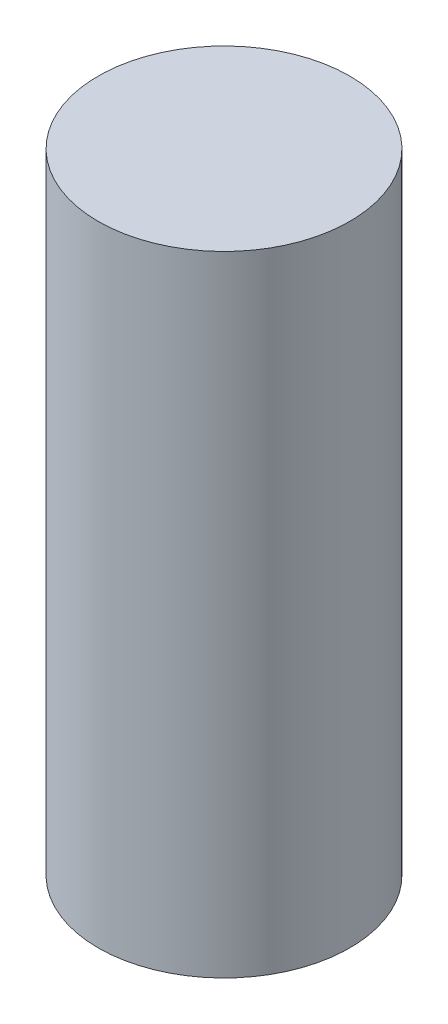
ISO-10303-21;
HEADER;
FILE_DESCRIPTION(('STEP AP214'),'2;1');
FILE_NAME('part.step','',(''),(''),'','','');
FILE_SCHEMA(('AUTOMOTIVE_DESIGN { 1 0 10303 214 1 1 1 1 }'));
ENDSEC;
DATA;
#1=APPLICATION_CONTEXT('core data for automotive mechanical design processes');
#2=APPLICATION_PROTOCOL_DEFINITION('international standard','automotive_design',2000,#1);
#3=PRODUCT_CONTEXT('',#1,'mechanical');
#4=PRODUCT('Part','Part','',(#3));
#5=PRODUCT_RELATED_PRODUCT_CATEGORY('part','',(#4));
#6=PRODUCT_DEFINITION_FORMATION('','',#4);
#7=PRODUCT_DEFINITION_CONTEXT('part definition',#1,'design');
#8=PRODUCT_DEFINITION('design','',#6,#7);
#9=PRODUCT_DEFINITION_SHAPE('','',#8);
#10=(LENGTH_UNIT() NAMED_UNIT(*) SI_UNIT(.MILLI.,.METRE.));
#11=(NAMED_UNIT(*) PLANE_ANGLE_UNIT() SI_UNIT($,.RADIAN.));
#12=(NAMED_UNIT(*) SI_UNIT($,.STERADIAN.) SOLID_ANGLE_UNIT());
#13=UNCERTAINTY_MEASURE_WITH_UNIT(LENGTH_MEASURE(1.E-05),#10,'distance_accuracy_value','');
#14=(GEOMETRIC_REPRESENTATION_CONTEXT(3) GLOBAL_UNCERTAINTY_ASSIGNED_CONTEXT((#13)) GLOBAL_UNIT_ASSIGNED_CONTEXT((#10,
#11,#12)) REPRESENTATION_CONTEXT('',''));
#15=CARTESIAN_POINT('',(0.,0.,0.));
#16=DIRECTION('',(0.,0.,1.));
#17=DIRECTION('',(1.,0.,0.));
#18=AXIS2_PLACEMENT_3D('',#15,#16,#17);
#19=CARTESIAN_POINT('',(0.,100.,0.));
#20=DIRECTION('',(0.,-1.,0.));
#21=DIRECTION('',(0.,0.,-1.));
#22=AXIS2_PLACEMENT_3D('',#19,#20,#21);
#23=CYLINDRICAL_SURFACE('',#22,20.);
#24=CARTESIAN_POINT('',(0.,100.,0.));
#25=DIRECTION('',(0.,1.,0.));
#26=DIRECTION('',(0.,0.,1.));
#27=AXIS2_PLACEMENT_3D('',#24,#25,#26);
#28=CIRCLE('',#27,20.);
#29=CARTESIAN_POINT('',(0.,100.,20.));
#30=VERTEX_POINT('',#29);
#31=EDGE_CURVE('E10',#30,#30,#28,.T.);
#32=ORIENTED_EDGE('',*,*,#31,.F.);
#33=EDGE_LOOP('',(#32));
#34=FACE_BOUND('',#33,.T.);
#35=CARTESIAN_POINT('',(0.,0.,0.));
#36=DIRECTION('',(0.,1.,0.));
#37=DIRECTION('',(0.,0.,1.));
#38=AXIS2_PLACEMENT_3D('',#35,#36,#37);
#39=CIRCLE('',#38,20.);
#40=CARTESIAN_POINT('',(0.,0.,20.));
#41=VERTEX_POINT('',#40);
#42=EDGE_CURVE('E44',#41,#41,#39,.T.);
#43=ORIENTED_EDGE('',*,*,#42,.T.);
#44=EDGE_LOOP('',(#43));
#45=FACE_BOUND('',#44,.T.);
#46=ADVANCED_FACE('F41',(#34,#45),#23,.T.);
#47=CARTESIAN_POINT('',(0.,100.,0.));
#48=DIRECTION('',(0.,1.,0.));
#49=DIRECTION('',(0.,0.,1.));
#50=AXIS2_PLACEMENT_3D('',#47,#48,#49);
#51=PLANE('',#50);
#52=ORIENTED_EDGE('',*,*,#31,.T.);
#53=EDGE_LOOP('',(#52));
#54=FACE_BOUND('',#53,.T.);
#55=ADVANCED_FACE('F58',(#54),#51,.T.);
#56=CARTESIAN_POINT('',(0.,0.,0.));
#57=DIRECTION('',(0.,1.,0.));
#58=DIRECTION('',(0.,0.,1.));
#59=AXIS2_PLACEMENT_3D('',#56,#57,#58);
#60=PLANE('',#59);
#61=ORIENTED_EDGE('',*,*,#42,.F.);
#62=EDGE_LOOP('',(#61));
#63=FACE_BOUND('',#62,.T.);
#64=ADVANCED_FACE('F56',(#63),#60,.F.);
#65=CLOSED_SHELL('',(#46,#55,#64));
#66=MANIFOLD_SOLID_BREP('B2',#65);
#67=ADVANCED_BREP_SHAPE_REPRESENTATION('',(#18,#66),#14);
#68=SHAPE_DEFINITION_REPRESENTATION(#9,#67);
ENDSEC;
END-ISO-10303-21;
